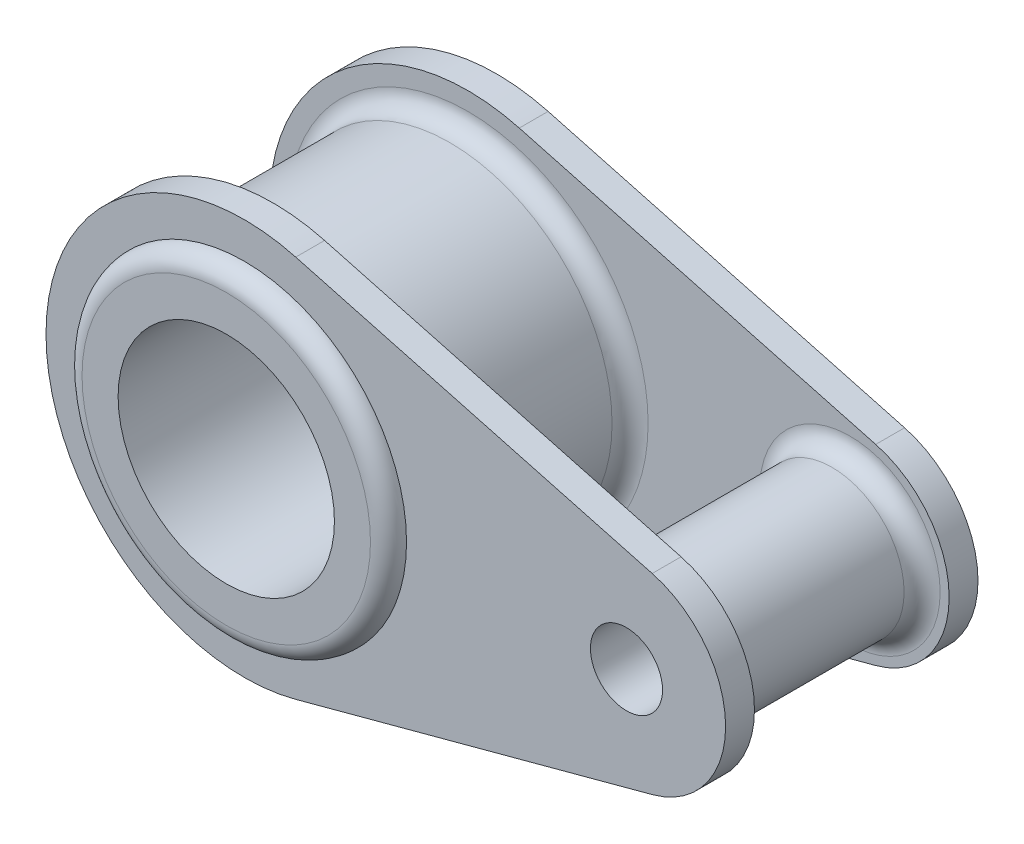
ISO-10303-21;
HEADER;
FILE_DESCRIPTION(('STEP AP214'),'2;1');
FILE_NAME('part.step','',(''),(''),'','','');
FILE_SCHEMA(('AUTOMOTIVE_DESIGN { 1 0 10303 214 1 1 1 1 }'));
ENDSEC;
DATA;
#1=APPLICATION_CONTEXT('core data for automotive mechanical design processes');
#2=APPLICATION_PROTOCOL_DEFINITION('international standard','automotive_design',2000,#1);
#3=PRODUCT_CONTEXT('',#1,'mechanical');
#4=PRODUCT('Part','Part','',(#3));
#5=PRODUCT_RELATED_PRODUCT_CATEGORY('part','',(#4));
#6=PRODUCT_DEFINITION_FORMATION('','',#4);
#7=PRODUCT_DEFINITION_CONTEXT('part definition',#1,'design');
#8=PRODUCT_DEFINITION('design','',#6,#7);
#9=PRODUCT_DEFINITION_SHAPE('','',#8);
#10=(LENGTH_UNIT() NAMED_UNIT(*) SI_UNIT(.MILLI.,.METRE.));
#11=(NAMED_UNIT(*) PLANE_ANGLE_UNIT() SI_UNIT($,.RADIAN.));
#12=(NAMED_UNIT(*) SI_UNIT($,.STERADIAN.) SOLID_ANGLE_UNIT());
#13=UNCERTAINTY_MEASURE_WITH_UNIT(LENGTH_MEASURE(1.E-05),#10,'distance_accuracy_value','');
#14=(GEOMETRIC_REPRESENTATION_CONTEXT(3) GLOBAL_UNCERTAINTY_ASSIGNED_CONTEXT((#13)) GLOBAL_UNIT_ASSIGNED_CONTEXT((#10,
#11,#12)) REPRESENTATION_CONTEXT('',''));
#15=CARTESIAN_POINT('',(0.,0.,0.));
#16=DIRECTION('',(0.,0.,1.));
#17=DIRECTION('',(1.,0.,0.));
#18=AXIS2_PLACEMENT_3D('',#15,#16,#17);
#19=CARTESIAN_POINT('',(0.,0.,80.));
#20=DIRECTION('',(0.,0.,-1.));
#21=DIRECTION('',(-1.,0.,0.));
#22=AXIS2_PLACEMENT_3D('',#19,#20,#21);
#23=CYLINDRICAL_SURFACE('',#22,45.);
#24=CARTESIAN_POINT('',(0.,0.,18.));
#25=DIRECTION('',(0.,0.,1.));
#26=DIRECTION('',(1.,0.,0.));
#27=AXIS2_PLACEMENT_3D('',#24,#25,#26);
#28=CIRCLE('',#27,45.);
#29=CARTESIAN_POINT('',(45.,0.,18.));
#30=VERTEX_POINT('',#29);
#31=EDGE_CURVE('E207',#30,#30,#28,.T.);
#32=ORIENTED_EDGE('',*,*,#31,.T.);
#33=EDGE_LOOP('',(#32));
#34=FACE_BOUND('',#33,.T.);
#35=CARTESIAN_POINT('',(0.,0.,62.));
#36=DIRECTION('',(0.,0.,1.));
#37=DIRECTION('',(1.,0.,0.));
#38=AXIS2_PLACEMENT_3D('',#35,#36,#37);
#39=CIRCLE('',#38,45.);
#40=CARTESIAN_POINT('',(45.,0.,62.));
#41=VERTEX_POINT('',#40);
#42=EDGE_CURVE('E201',#41,#41,#39,.F.);
#43=ORIENTED_EDGE('',*,*,#42,.T.);
#44=EDGE_LOOP('',(#43));
#45=FACE_BOUND('',#44,.T.);
#46=ADVANCED_FACE('F43',(#34,#45),#23,.T.);
#47=CARTESIAN_POINT('',(0.,0.,80.));
#48=DIRECTION('',(0.,0.,-1.));
#49=DIRECTION('',(-1.,0.,0.));
#50=AXIS2_PLACEMENT_3D('',#47,#48,#49);
#51=CYLINDRICAL_SURFACE('',#50,30.);
#52=CARTESIAN_POINT('',(0.,0.,80.));
#53=DIRECTION('',(0.,0.,1.));
#54=DIRECTION('',(1.,0.,0.));
#55=AXIS2_PLACEMENT_3D('',#52,#53,#54);
#56=CIRCLE('',#55,30.);
#57=CARTESIAN_POINT('',(30.,0.,80.));
#58=VERTEX_POINT('',#57);
#59=EDGE_CURVE('E184',#58,#58,#56,.T.);
#60=ORIENTED_EDGE('',*,*,#59,.T.);
#61=EDGE_LOOP('',(#60));
#62=FACE_BOUND('',#61,.T.);
#63=CARTESIAN_POINT('',(0.,0.,0.));
#64=DIRECTION('',(0.,0.,1.));
#65=DIRECTION('',(1.,0.,0.));
#66=AXIS2_PLACEMENT_3D('',#63,#64,#65);
#67=CIRCLE('',#66,30.);
#68=CARTESIAN_POINT('',(30.,0.,0.));
#69=VERTEX_POINT('',#68);
#70=EDGE_CURVE('E183',#69,#69,#67,.T.);
#71=ORIENTED_EDGE('',*,*,#70,.F.);
#72=EDGE_LOOP('',(#71));
#73=FACE_BOUND('',#72,.T.);
#74=ADVANCED_FACE('F247',(#62,#73),#51,.F.);
#75=CARTESIAN_POINT('',(0.,0.,80.));
#76=DIRECTION('',(0.,0.,1.));
#77=DIRECTION('',(1.,0.,0.));
#78=AXIS2_PLACEMENT_3D('',#75,#76,#77);
#79=PLANE('',#78);
#80=CARTESIAN_POINT('',(0.,0.,80.));
#81=DIRECTION('',(0.,0.,1.));
#82=DIRECTION('',(1.,0.,0.));
#83=AXIS2_PLACEMENT_3D('',#80,#81,#82);
#84=CIRCLE('',#83,40.);
#85=CARTESIAN_POINT('',(40.,0.,80.));
#86=VERTEX_POINT('',#85);
#87=EDGE_CURVE('E198',#86,#86,#84,.T.);
#88=ORIENTED_EDGE('',*,*,#87,.T.);
#89=EDGE_LOOP('',(#88));
#90=FACE_BOUND('',#89,.T.);
#91=ORIENTED_EDGE('',*,*,#59,.F.);
#92=EDGE_LOOP('',(#91));
#93=FACE_BOUND('',#92,.T.);
#94=ADVANCED_FACE('F254',(#90,#93),#79,.T.);
#95=CARTESIAN_POINT('',(0.,0.,0.));
#96=DIRECTION('',(0.,0.,1.));
#97=DIRECTION('',(1.,0.,0.));
#98=AXIS2_PLACEMENT_3D('',#95,#96,#97);
#99=PLANE('',#98);
#100=CARTESIAN_POINT('',(0.,0.,0.));
#101=DIRECTION('',(0.,0.,1.));
#102=DIRECTION('',(1.,0.,0.));
#103=AXIS2_PLACEMENT_3D('',#100,#101,#102);
#104=CIRCLE('',#103,40.);
#105=CARTESIAN_POINT('',(40.,0.,0.));
#106=VERTEX_POINT('',#105);
#107=EDGE_CURVE('E195',#106,#106,#104,.F.);
#108=ORIENTED_EDGE('',*,*,#107,.T.);
#109=EDGE_LOOP('',(#108));
#110=FACE_BOUND('',#109,.T.);
#111=ORIENTED_EDGE('',*,*,#70,.T.);
#112=EDGE_LOOP('',(#111));
#113=FACE_BOUND('',#112,.T.);
#114=ADVANCED_FACE('F259',(#110,#113),#99,.F.);
#115=CARTESIAN_POINT('',(0.,0.,5.));
#116=DIRECTION('',(0.,0.,1.));
#117=DIRECTION('',(1.,0.,0.));
#118=AXIS2_PLACEMENT_3D('',#115,#116,#117);
#119=TOROIDAL_SURFACE('',#118,40.,5.);
#120=ORIENTED_EDGE('',*,*,#107,.F.);
#121=EDGE_LOOP('',(#120));
#122=FACE_BOUND('',#121,.T.);
#123=CARTESIAN_POINT('',(0.,0.,5.));
#124=DIRECTION('',(0.,0.,1.));
#125=DIRECTION('',(1.,0.,0.));
#126=AXIS2_PLACEMENT_3D('',#123,#124,#125);
#127=CIRCLE('',#126,45.);
#128=CARTESIAN_POINT('',(45.,0.,5.));
#129=VERTEX_POINT('',#128);
#130=EDGE_CURVE('E192',#129,#129,#127,.T.);
#131=ORIENTED_EDGE('',*,*,#130,.F.);
#132=EDGE_LOOP('',(#131));
#133=FACE_BOUND('',#132,.T.);
#134=ADVANCED_FACE('F262',(#122,#133),#119,.T.);
#135=CARTESIAN_POINT('',(0.,0.,75.));
#136=DIRECTION('',(0.,0.,1.));
#137=DIRECTION('',(1.,0.,0.));
#138=AXIS2_PLACEMENT_3D('',#135,#136,#137);
#139=TOROIDAL_SURFACE('',#138,40.,5.);
#140=CARTESIAN_POINT('',(0.,0.,75.));
#141=DIRECTION('',(0.,0.,1.));
#142=DIRECTION('',(1.,0.,0.));
#143=AXIS2_PLACEMENT_3D('',#140,#141,#142);
#144=CIRCLE('',#143,45.);
#145=CARTESIAN_POINT('',(45.,0.,75.));
#146=VERTEX_POINT('',#145);
#147=EDGE_CURVE('E187',#146,#146,#144,.F.);
#148=ORIENTED_EDGE('',*,*,#147,.F.);
#149=EDGE_LOOP('',(#148));
#150=FACE_BOUND('',#149,.T.);
#151=ORIENTED_EDGE('',*,*,#87,.F.);
#152=EDGE_LOOP('',(#151));
#153=FACE_BOUND('',#152,.T.);
#154=ADVANCED_FACE('F265',(#150,#153),#139,.T.);
#155=CARTESIAN_POINT('',(0.,0.,13.));
#156=DIRECTION('',(0.,0.,-1.));
#157=DIRECTION('',(-1.,0.,0.));
#158=AXIS2_PLACEMENT_3D('',#155,#156,#157);
#159=CYLINDRICAL_SURFACE('',#158,55.);
#160=CARTESIAN_POINT('',(0.,0.,5.));
#161=DIRECTION('',(0.,0.,1.));
#162=DIRECTION('',(1.,0.,0.));
#163=AXIS2_PLACEMENT_3D('',#160,#161,#162);
#164=CIRCLE('',#163,55.);
#165=CARTESIAN_POINT('',(14.2688679245283,53.1168467451934,5.));
#166=VERTEX_POINT('',#165);
#167=CARTESIAN_POINT('',(14.2688679245283,-53.1168467451934,5.));
#168=VERTEX_POINT('',#167);
#169=EDGE_CURVE('E157',#166,#168,#164,.T.);
#170=ORIENTED_EDGE('',*,*,#169,.T.);
#171=DIRECTION('',(0.,0.,-1.));
#172=VECTOR('',#171,1.);
#173=CARTESIAN_POINT('',(14.2688679245283,-53.1168467451934,13.));
#174=LINE('',#173,#172);
#175=CARTESIAN_POINT('',(14.2688679245283,-53.1168467451934,13.));
#176=VERTEX_POINT('',#175);
#177=EDGE_CURVE('E181',#176,#168,#174,.T.);
#178=ORIENTED_EDGE('',*,*,#177,.F.);
#179=CARTESIAN_POINT('',(0.,0.,13.));
#180=DIRECTION('',(0.,0.,1.));
#181=DIRECTION('',(1.,0.,0.));
#182=AXIS2_PLACEMENT_3D('',#179,#180,#181);
#183=CIRCLE('',#182,55.);
#184=CARTESIAN_POINT('',(14.2688679245283,53.1168467451934,13.));
#185=VERTEX_POINT('',#184);
#186=EDGE_CURVE('E161',#185,#176,#183,.T.);
#187=ORIENTED_EDGE('',*,*,#186,.F.);
#188=DIRECTION('',(0.,0.,-1.));
#189=VECTOR('',#188,1.);
#190=CARTESIAN_POINT('',(14.2688679245283,53.1168467451934,13.));
#191=LINE('',#190,#189);
#192=EDGE_CURVE('E60',#185,#166,#191,.T.);
#193=ORIENTED_EDGE('',*,*,#192,.T.);
#194=EDGE_LOOP('',(#170,#178,#187,#193));
#195=FACE_BOUND('',#194,.T.);
#196=ADVANCED_FACE('F269',(#195),#159,.T.);
#197=CARTESIAN_POINT('',(14.2688679245283,-53.1168467451934,13.));
#198=DIRECTION('',(-0.259433962264151,0.965760849912608,0.));
#199=DIRECTION('',(-0.965760849912608,-0.259433962264151,0.));
#200=AXIS2_PLACEMENT_3D('',#197,#198,#199);
#201=PLANE('',#200);
#202=DIRECTION('',(0.965760849912608,0.259433962264151,0.));
#203=VECTOR('',#202,1.);
#204=CARTESIAN_POINT('',(14.2688679245283,-53.1168467451934,5.));
#205=LINE('',#204,#203);
#206=CARTESIAN_POINT('',(113.134433962264,-26.5584233725967,5.));
#207=VERTEX_POINT('',#206);
#208=EDGE_CURVE('E170',#168,#207,#205,.T.);
#209=ORIENTED_EDGE('',*,*,#208,.T.);
#210=DIRECTION('',(0.,0.,-1.));
#211=VECTOR('',#210,1.);
#212=CARTESIAN_POINT('',(113.134433962264,-26.5584233725967,13.));
#213=LINE('',#212,#211);
#214=CARTESIAN_POINT('',(113.134433962264,-26.5584233725967,13.));
#215=VERTEX_POINT('',#214);
#216=EDGE_CURVE('E178',#215,#207,#213,.T.);
#217=ORIENTED_EDGE('',*,*,#216,.F.);
#218=DIRECTION('',(0.965760849912608,0.259433962264151,0.));
#219=VECTOR('',#218,1.);
#220=CARTESIAN_POINT('',(14.2688679245283,-53.1168467451934,13.));
#221=LINE('',#220,#219);
#222=EDGE_CURVE('E88',#176,#215,#221,.T.);
#223=ORIENTED_EDGE('',*,*,#222,.F.);
#224=ORIENTED_EDGE('',*,*,#177,.T.);
#225=EDGE_LOOP('',(#209,#217,#223,#224));
#226=FACE_BOUND('',#225,.T.);
#227=ADVANCED_FACE('F316',(#226),#201,.F.);
#228=CARTESIAN_POINT('',(106.,0.,13.));
#229=DIRECTION('',(0.,0.,-1.));
#230=DIRECTION('',(-1.,0.,0.));
#231=AXIS2_PLACEMENT_3D('',#228,#229,#230);
#232=CYLINDRICAL_SURFACE('',#231,27.5);
#233=CARTESIAN_POINT('',(106.,0.,5.));
#234=DIRECTION('',(0.,0.,1.));
#235=DIRECTION('',(1.,0.,0.));
#236=AXIS2_PLACEMENT_3D('',#233,#234,#235);
#237=CIRCLE('',#236,27.5);
#238=CARTESIAN_POINT('',(113.134433962264,26.5584233725967,5.));
#239=VERTEX_POINT('',#238);
#240=EDGE_CURVE('E172',#207,#239,#237,.T.);
#241=ORIENTED_EDGE('',*,*,#240,.T.);
#242=DIRECTION('',(0.,0.,-1.));
#243=VECTOR('',#242,1.);
#244=CARTESIAN_POINT('',(113.134433962264,26.5584233725967,13.));
#245=LINE('',#244,#243);
#246=CARTESIAN_POINT('',(113.134433962264,26.5584233725967,13.));
#247=VERTEX_POINT('',#246);
#248=EDGE_CURVE('E76',#247,#239,#245,.T.);
#249=ORIENTED_EDGE('',*,*,#248,.F.);
#250=CARTESIAN_POINT('',(106.,0.,13.));
#251=DIRECTION('',(0.,0.,1.));
#252=DIRECTION('',(1.,0.,0.));
#253=AXIS2_PLACEMENT_3D('',#250,#251,#252);
#254=CIRCLE('',#253,27.5);
#255=EDGE_CURVE('E165',#215,#247,#254,.T.);
#256=ORIENTED_EDGE('',*,*,#255,.F.);
#257=ORIENTED_EDGE('',*,*,#216,.T.);
#258=EDGE_LOOP('',(#241,#249,#256,#257));
#259=FACE_BOUND('',#258,.T.);
#260=ADVANCED_FACE('F309',(#259),#232,.T.);
#261=CARTESIAN_POINT('',(14.2688679245283,53.1168467451934,13.));
#262=DIRECTION('',(0.259433962264151,0.965760849912608,0.));
#263=DIRECTION('',(-0.965760849912608,0.259433962264151,0.));
#264=AXIS2_PLACEMENT_3D('',#261,#262,#263);
#265=PLANE('',#264);
#266=DIRECTION('',(0.965760849912608,-0.259433962264151,0.));
#267=VECTOR('',#266,1.);
#268=CARTESIAN_POINT('',(14.2688679245283,53.1168467451934,5.));
#269=LINE('',#268,#267);
#270=EDGE_CURVE('E163',#166,#239,#269,.T.);
#271=ORIENTED_EDGE('',*,*,#270,.F.);
#272=ORIENTED_EDGE('',*,*,#192,.F.);
#273=DIRECTION('',(0.965760849912608,-0.259433962264151,0.));
#274=VECTOR('',#273,1.);
#275=CARTESIAN_POINT('',(14.2688679245283,53.1168467451934,13.));
#276=LINE('',#275,#274);
#277=EDGE_CURVE('E167',#185,#247,#276,.T.);
#278=ORIENTED_EDGE('',*,*,#277,.T.);
#279=ORIENTED_EDGE('',*,*,#248,.T.);
#280=EDGE_LOOP('',(#271,#272,#278,#279));
#281=FACE_BOUND('',#280,.T.);
#282=ADVANCED_FACE('F307',(#281),#265,.T.);
#283=CARTESIAN_POINT('',(0.,0.,13.));
#284=DIRECTION('',(0.,0.,1.));
#285=DIRECTION('',(1.,0.,0.));
#286=AXIS2_PLACEMENT_3D('',#283,#284,#285);
#287=PLANE('',#286);
#288=CARTESIAN_POINT('',(0.,0.,13.));
#289=DIRECTION('',(0.,0.,1.));
#290=DIRECTION('',(1.,0.,0.));
#291=AXIS2_PLACEMENT_3D('',#288,#289,#290);
#292=CIRCLE('',#291,50.);
#293=CARTESIAN_POINT('',(50.,0.,13.));
#294=VERTEX_POINT('',#293);
#295=EDGE_CURVE('E213',#294,#294,#292,.F.);
#296=ORIENTED_EDGE('',*,*,#295,.T.);
#297=EDGE_LOOP('',(#296));
#298=FACE_BOUND('',#297,.T.);
#299=CARTESIAN_POINT('',(106.,0.,13.));
#300=DIRECTION('',(0.,0.,1.));
#301=DIRECTION('',(1.,0.,0.));
#302=AXIS2_PLACEMENT_3D('',#299,#300,#301);
#303=CIRCLE('',#302,25.);
#304=CARTESIAN_POINT('',(131.,0.,13.));
#305=VERTEX_POINT('',#304);
#306=EDGE_CURVE('E210',#305,#305,#303,.F.);
#307=ORIENTED_EDGE('',*,*,#306,.T.);
#308=EDGE_LOOP('',(#307));
#309=FACE_BOUND('',#308,.T.);
#310=ORIENTED_EDGE('',*,*,#186,.T.);
#311=ORIENTED_EDGE('',*,*,#222,.T.);
#312=ORIENTED_EDGE('',*,*,#255,.T.);
#313=ORIENTED_EDGE('',*,*,#277,.F.);
#314=EDGE_LOOP('',(#310,#311,#312,#313));
#315=FACE_BOUND('',#314,.T.);
#316=ADVANCED_FACE('F301',(#298,#309,#315),#287,.T.);
#317=CARTESIAN_POINT('',(0.,0.,5.));
#318=DIRECTION('',(0.,0.,1.));
#319=DIRECTION('',(1.,0.,0.));
#320=AXIS2_PLACEMENT_3D('',#317,#318,#319);
#321=PLANE('',#320);
#322=CARTESIAN_POINT('',(106.,0.,5.));
#323=DIRECTION('',(0.,0.,1.));
#324=DIRECTION('',(1.,0.,0.));
#325=AXIS2_PLACEMENT_3D('',#322,#323,#324);
#326=CIRCLE('',#325,9.99999999999999);
#327=CARTESIAN_POINT('',(116.,0.,5.));
#328=VERTEX_POINT('',#327);
#329=EDGE_CURVE('E147',#328,#328,#326,.T.);
#330=ORIENTED_EDGE('',*,*,#329,.T.);
#331=EDGE_LOOP('',(#330));
#332=FACE_BOUND('',#331,.T.);
#333=ORIENTED_EDGE('',*,*,#130,.T.);
#334=EDGE_LOOP('',(#333));
#335=FACE_BOUND('',#334,.T.);
#336=ORIENTED_EDGE('',*,*,#169,.F.);
#337=ORIENTED_EDGE('',*,*,#270,.T.);
#338=ORIENTED_EDGE('',*,*,#240,.F.);
#339=ORIENTED_EDGE('',*,*,#208,.F.);
#340=EDGE_LOOP('',(#336,#337,#338,#339));
#341=FACE_BOUND('',#340,.T.);
#342=ADVANCED_FACE('F298',(#332,#335,#341),#321,.F.);
#343=CARTESIAN_POINT('',(0.,0.,67.));
#344=DIRECTION('',(0.,0.,1.));
#345=DIRECTION('',(1.,0.,0.));
#346=AXIS2_PLACEMENT_3D('',#343,#344,#345);
#347=CYLINDRICAL_SURFACE('',#346,55.);
#348=CARTESIAN_POINT('',(0.,0.,75.));
#349=DIRECTION('',(0.,0.,1.));
#350=DIRECTION('',(1.,0.,0.));
#351=AXIS2_PLACEMENT_3D('',#348,#349,#350);
#352=CIRCLE('',#351,55.);
#353=CARTESIAN_POINT('',(14.2688679245283,53.1168467451934,75.));
#354=VERTEX_POINT('',#353);
#355=CARTESIAN_POINT('',(14.2688679245283,-53.1168467451934,75.));
#356=VERTEX_POINT('',#355);
#357=EDGE_CURVE('E151',#354,#356,#352,.T.);
#358=ORIENTED_EDGE('',*,*,#357,.F.);
#359=DIRECTION('',(0.,0.,1.));
#360=VECTOR('',#359,1.);
#361=CARTESIAN_POINT('',(14.2688679245283,53.1168467451934,67.));
#362=LINE('',#361,#360);
#363=CARTESIAN_POINT('',(14.2688679245283,53.1168467451934,67.));
#364=VERTEX_POINT('',#363);
#365=EDGE_CURVE('E140',#364,#354,#362,.T.);
#366=ORIENTED_EDGE('',*,*,#365,.F.);
#367=CARTESIAN_POINT('',(0.,0.,67.));
#368=DIRECTION('',(0.,0.,1.));
#369=DIRECTION('',(1.,0.,0.));
#370=AXIS2_PLACEMENT_3D('',#367,#368,#369);
#371=CIRCLE('',#370,55.);
#372=CARTESIAN_POINT('',(14.2688679245283,-53.1168467451934,67.));
#373=VERTEX_POINT('',#372);
#374=EDGE_CURVE('E134',#364,#373,#371,.T.);
#375=ORIENTED_EDGE('',*,*,#374,.T.);
#376=DIRECTION('',(0.,0.,1.));
#377=VECTOR('',#376,1.);
#378=CARTESIAN_POINT('',(14.2688679245283,-53.1168467451934,67.));
#379=LINE('',#378,#377);
#380=EDGE_CURVE('E116',#373,#356,#379,.T.);
#381=ORIENTED_EDGE('',*,*,#380,.T.);
#382=EDGE_LOOP('',(#358,#366,#375,#381));
#383=FACE_BOUND('',#382,.T.);
#384=ADVANCED_FACE('F139',(#383),#347,.T.);
#385=CARTESIAN_POINT('',(113.134433962264,26.5584233725967,67.));
#386=DIRECTION('',(0.259433962264151,0.965760849912608,0.));
#387=DIRECTION('',(-0.965760849912608,0.259433962264151,0.));
#388=AXIS2_PLACEMENT_3D('',#385,#386,#387);
#389=PLANE('',#388);
#390=DIRECTION('',(-0.965760849912608,0.259433962264151,0.));
#391=VECTOR('',#390,1.);
#392=CARTESIAN_POINT('',(113.134433962264,26.5584233725967,75.));
#393=LINE('',#392,#391);
#394=CARTESIAN_POINT('',(113.134433962264,26.5584233725967,75.));
#395=VERTEX_POINT('',#394);
#396=EDGE_CURVE('E141',#395,#354,#393,.T.);
#397=ORIENTED_EDGE('',*,*,#396,.F.);
#398=DIRECTION('',(0.,0.,1.));
#399=VECTOR('',#398,1.);
#400=CARTESIAN_POINT('',(113.134433962264,26.5584233725967,67.));
#401=LINE('',#400,#399);
#402=CARTESIAN_POINT('',(113.134433962264,26.5584233725967,67.));
#403=VERTEX_POINT('',#402);
#404=EDGE_CURVE('E158',#403,#395,#401,.T.);
#405=ORIENTED_EDGE('',*,*,#404,.F.);
#406=DIRECTION('',(-0.965760849912608,0.259433962264151,0.));
#407=VECTOR('',#406,1.);
#408=CARTESIAN_POINT('',(113.134433962264,26.5584233725967,67.));
#409=LINE('',#408,#407);
#410=EDGE_CURVE('E127',#403,#364,#409,.T.);
#411=ORIENTED_EDGE('',*,*,#410,.T.);
#412=ORIENTED_EDGE('',*,*,#365,.T.);
#413=EDGE_LOOP('',(#397,#405,#411,#412));
#414=FACE_BOUND('',#413,.T.);
#415=ADVANCED_FACE('F411',(#414),#389,.T.);
#416=CARTESIAN_POINT('',(106.,0.,67.));
#417=DIRECTION('',(0.,0.,1.));
#418=DIRECTION('',(1.,0.,0.));
#419=AXIS2_PLACEMENT_3D('',#416,#417,#418);
#420=CYLINDRICAL_SURFACE('',#419,27.5);
#421=CARTESIAN_POINT('',(106.,0.,75.));
#422=DIRECTION('',(0.,0.,1.));
#423=DIRECTION('',(1.,0.,0.));
#424=AXIS2_PLACEMENT_3D('',#421,#422,#423);
#425=CIRCLE('',#424,27.5);
#426=CARTESIAN_POINT('',(113.134433962264,-26.5584233725967,75.));
#427=VERTEX_POINT('',#426);
#428=EDGE_CURVE('E144',#427,#395,#425,.T.);
#429=ORIENTED_EDGE('',*,*,#428,.F.);
#430=DIRECTION('',(0.,0.,1.));
#431=VECTOR('',#430,1.);
#432=CARTESIAN_POINT('',(113.134433962264,-26.5584233725967,67.));
#433=LINE('',#432,#431);
#434=CARTESIAN_POINT('',(113.134433962264,-26.5584233725967,67.));
#435=VERTEX_POINT('',#434);
#436=EDGE_CURVE('E126',#435,#427,#433,.T.);
#437=ORIENTED_EDGE('',*,*,#436,.F.);
#438=CARTESIAN_POINT('',(106.,0.,67.));
#439=DIRECTION('',(0.,0.,1.));
#440=DIRECTION('',(1.,0.,0.));
#441=AXIS2_PLACEMENT_3D('',#438,#439,#440);
#442=CIRCLE('',#441,27.5);
#443=EDGE_CURVE('E137',#435,#403,#442,.T.);
#444=ORIENTED_EDGE('',*,*,#443,.T.);
#445=ORIENTED_EDGE('',*,*,#404,.T.);
#446=EDGE_LOOP('',(#429,#437,#444,#445));
#447=FACE_BOUND('',#446,.T.);
#448=ADVANCED_FACE('F243',(#447),#420,.T.);
#449=CARTESIAN_POINT('',(14.2688679245283,-53.1168467451934,67.));
#450=DIRECTION('',(0.259433962264151,-0.965760849912608,0.));
#451=DIRECTION('',(0.965760849912608,0.259433962264151,0.));
#452=AXIS2_PLACEMENT_3D('',#449,#450,#451);
#453=PLANE('',#452);
#454=DIRECTION('',(0.965760849912608,0.259433962264151,0.));
#455=VECTOR('',#454,1.);
#456=CARTESIAN_POINT('',(14.2688679245283,-53.1168467451934,75.));
#457=LINE('',#456,#455);
#458=EDGE_CURVE('E121',#356,#427,#457,.T.);
#459=ORIENTED_EDGE('',*,*,#458,.F.);
#460=ORIENTED_EDGE('',*,*,#380,.F.);
#461=DIRECTION('',(0.965760849912608,0.259433962264151,0.));
#462=VECTOR('',#461,1.);
#463=CARTESIAN_POINT('',(14.2688679245283,-53.1168467451934,67.));
#464=LINE('',#463,#462);
#465=EDGE_CURVE('E119',#373,#435,#464,.T.);
#466=ORIENTED_EDGE('',*,*,#465,.T.);
#467=ORIENTED_EDGE('',*,*,#436,.T.);
#468=EDGE_LOOP('',(#459,#460,#466,#467));
#469=FACE_BOUND('',#468,.T.);
#470=ADVANCED_FACE('F118',(#469),#453,.T.);
#471=CARTESIAN_POINT('',(0.,0.,67.));
#472=DIRECTION('',(0.,0.,1.));
#473=DIRECTION('',(1.,0.,0.));
#474=AXIS2_PLACEMENT_3D('',#471,#472,#473);
#475=PLANE('',#474);
#476=CARTESIAN_POINT('',(0.,0.,67.));
#477=DIRECTION('',(0.,0.,1.));
#478=DIRECTION('',(1.,0.,0.));
#479=AXIS2_PLACEMENT_3D('',#476,#477,#478);
#480=CIRCLE('',#479,50.);
#481=CARTESIAN_POINT('',(50.,0.,67.));
#482=VERTEX_POINT('',#481);
#483=EDGE_CURVE('E219',#482,#482,#480,.T.);
#484=ORIENTED_EDGE('',*,*,#483,.T.);
#485=EDGE_LOOP('',(#484));
#486=FACE_BOUND('',#485,.T.);
#487=CARTESIAN_POINT('',(106.,0.,67.));
#488=DIRECTION('',(0.,0.,1.));
#489=DIRECTION('',(1.,0.,0.));
#490=AXIS2_PLACEMENT_3D('',#487,#488,#489);
#491=CIRCLE('',#490,25.);
#492=CARTESIAN_POINT('',(131.,0.,67.));
#493=VERTEX_POINT('',#492);
#494=EDGE_CURVE('E216',#493,#493,#491,.T.);
#495=ORIENTED_EDGE('',*,*,#494,.T.);
#496=EDGE_LOOP('',(#495));
#497=FACE_BOUND('',#496,.T.);
#498=ORIENTED_EDGE('',*,*,#374,.F.);
#499=ORIENTED_EDGE('',*,*,#410,.F.);
#500=ORIENTED_EDGE('',*,*,#443,.F.);
#501=ORIENTED_EDGE('',*,*,#465,.F.);
#502=EDGE_LOOP('',(#498,#499,#500,#501));
#503=FACE_BOUND('',#502,.T.);
#504=ADVANCED_FACE('F132',(#486,#497,#503),#475,.F.);
#505=CARTESIAN_POINT('',(0.,0.,75.));
#506=DIRECTION('',(0.,0.,1.));
#507=DIRECTION('',(1.,0.,0.));
#508=AXIS2_PLACEMENT_3D('',#505,#506,#507);
#509=PLANE('',#508);
#510=CARTESIAN_POINT('',(106.,0.,75.));
#511=DIRECTION('',(0.,0.,1.));
#512=DIRECTION('',(1.,0.,0.));
#513=AXIS2_PLACEMENT_3D('',#510,#511,#512);
#514=CIRCLE('',#513,9.99999999999999);
#515=CARTESIAN_POINT('',(116.,0.,75.));
#516=VERTEX_POINT('',#515);
#517=EDGE_CURVE('E202',#516,#516,#514,.T.);
#518=ORIENTED_EDGE('',*,*,#517,.F.);
#519=EDGE_LOOP('',(#518));
#520=FACE_BOUND('',#519,.T.);
#521=ORIENTED_EDGE('',*,*,#147,.T.);
#522=EDGE_LOOP('',(#521));
#523=FACE_BOUND('',#522,.T.);
#524=ORIENTED_EDGE('',*,*,#357,.T.);
#525=ORIENTED_EDGE('',*,*,#458,.T.);
#526=ORIENTED_EDGE('',*,*,#428,.T.);
#527=ORIENTED_EDGE('',*,*,#396,.T.);
#528=EDGE_LOOP('',(#524,#525,#526,#527));
#529=FACE_BOUND('',#528,.T.);
#530=ADVANCED_FACE('F232',(#520,#523,#529),#509,.T.);
#531=CARTESIAN_POINT('',(106.,0.,75.));
#532=DIRECTION('',(0.,0.,-1.));
#533=DIRECTION('',(-1.,0.,0.));
#534=AXIS2_PLACEMENT_3D('',#531,#532,#533);
#535=CYLINDRICAL_SURFACE('',#534,20.);
#536=CARTESIAN_POINT('',(106.,0.,18.));
#537=DIRECTION('',(0.,0.,1.));
#538=DIRECTION('',(1.,0.,0.));
#539=AXIS2_PLACEMENT_3D('',#536,#537,#538);
#540=CIRCLE('',#539,20.);
#541=CARTESIAN_POINT('',(126.,0.,18.));
#542=VERTEX_POINT('',#541);
#543=EDGE_CURVE('E11',#542,#542,#540,.T.);
#544=ORIENTED_EDGE('',*,*,#543,.T.);
#545=EDGE_LOOP('',(#544));
#546=FACE_BOUND('',#545,.T.);
#547=CARTESIAN_POINT('',(106.,0.,62.));
#548=DIRECTION('',(0.,0.,1.));
#549=DIRECTION('',(1.,0.,0.));
#550=AXIS2_PLACEMENT_3D('',#547,#548,#549);
#551=CIRCLE('',#550,20.);
#552=CARTESIAN_POINT('',(126.,0.,62.));
#553=VERTEX_POINT('',#552);
#554=EDGE_CURVE('E52',#553,#553,#551,.F.);
#555=ORIENTED_EDGE('',*,*,#554,.T.);
#556=EDGE_LOOP('',(#555));
#557=FACE_BOUND('',#556,.T.);
#558=ADVANCED_FACE('F224',(#546,#557),#535,.T.);
#559=CARTESIAN_POINT('',(106.,0.,80.));
#560=DIRECTION('',(0.,0.,-1.));
#561=DIRECTION('',(-1.,0.,0.));
#562=AXIS2_PLACEMENT_3D('',#559,#560,#561);
#563=CYLINDRICAL_SURFACE('',#562,9.99999999999999);
#564=ORIENTED_EDGE('',*,*,#517,.T.);
#565=EDGE_LOOP('',(#564));
#566=FACE_BOUND('',#565,.T.);
#567=ORIENTED_EDGE('',*,*,#329,.F.);
#568=EDGE_LOOP('',(#567));
#569=FACE_BOUND('',#568,.T.);
#570=ADVANCED_FACE('F275',(#566,#569),#563,.F.);
#571=CARTESIAN_POINT('',(0.,0.,18.));
#572=DIRECTION('',(0.,0.,1.));
#573=DIRECTION('',(1.,0.,0.));
#574=AXIS2_PLACEMENT_3D('',#571,#572,#573);
#575=TOROIDAL_SURFACE('',#574,50.,5.);
#576=ORIENTED_EDGE('',*,*,#295,.F.);
#577=EDGE_LOOP('',(#576));
#578=FACE_BOUND('',#577,.T.);
#579=ORIENTED_EDGE('',*,*,#31,.F.);
#580=EDGE_LOOP('',(#579));
#581=FACE_BOUND('',#580,.T.);
#582=ADVANCED_FACE('F271',(#578,#581),#575,.F.);
#583=CARTESIAN_POINT('',(0.,0.,62.));
#584=DIRECTION('',(0.,0.,1.));
#585=DIRECTION('',(1.,0.,0.));
#586=AXIS2_PLACEMENT_3D('',#583,#584,#585);
#587=TOROIDAL_SURFACE('',#586,50.,5.);
#588=ORIENTED_EDGE('',*,*,#42,.F.);
#589=EDGE_LOOP('',(#588));
#590=FACE_BOUND('',#589,.T.);
#591=ORIENTED_EDGE('',*,*,#483,.F.);
#592=EDGE_LOOP('',(#591));
#593=FACE_BOUND('',#592,.T.);
#594=ADVANCED_FACE('F274',(#590,#593),#587,.F.);
#595=CARTESIAN_POINT('',(106.,0.,18.));
#596=DIRECTION('',(0.,0.,1.));
#597=DIRECTION('',(1.,0.,0.));
#598=AXIS2_PLACEMENT_3D('',#595,#596,#597);
#599=TOROIDAL_SURFACE('',#598,25.,5.);
#600=ORIENTED_EDGE('',*,*,#306,.F.);
#601=EDGE_LOOP('',(#600));
#602=FACE_BOUND('',#601,.T.);
#603=ORIENTED_EDGE('',*,*,#543,.F.);
#604=EDGE_LOOP('',(#603));
#605=FACE_BOUND('',#604,.T.);
#606=ADVANCED_FACE('F228',(#602,#605),#599,.F.);
#607=CARTESIAN_POINT('',(106.,0.,62.));
#608=DIRECTION('',(0.,0.,1.));
#609=DIRECTION('',(1.,0.,0.));
#610=AXIS2_PLACEMENT_3D('',#607,#608,#609);
#611=TOROIDAL_SURFACE('',#610,25.,5.);
#612=ORIENTED_EDGE('',*,*,#554,.F.);
#613=EDGE_LOOP('',(#612));
#614=FACE_BOUND('',#613,.T.);
#615=ORIENTED_EDGE('',*,*,#494,.F.);
#616=EDGE_LOOP('',(#615));
#617=FACE_BOUND('',#616,.T.);
#618=ADVANCED_FACE('F45',(#614,#617),#611,.F.);
#619=CLOSED_SHELL('',(#46,#74,#94,#114,#134,#154,#196,#227,#260,#282,#316,#342,#384,#415,#448,
#470,#504,#530,#558,#570,#582,#594,#606,#618));
#620=MANIFOLD_SOLID_BREP('B2',#619);
#621=ADVANCED_BREP_SHAPE_REPRESENTATION('',(#18,#620),#14);
#622=SHAPE_DEFINITION_REPRESENTATION(#9,#621);
ENDSEC;
END-ISO-10303-21;
